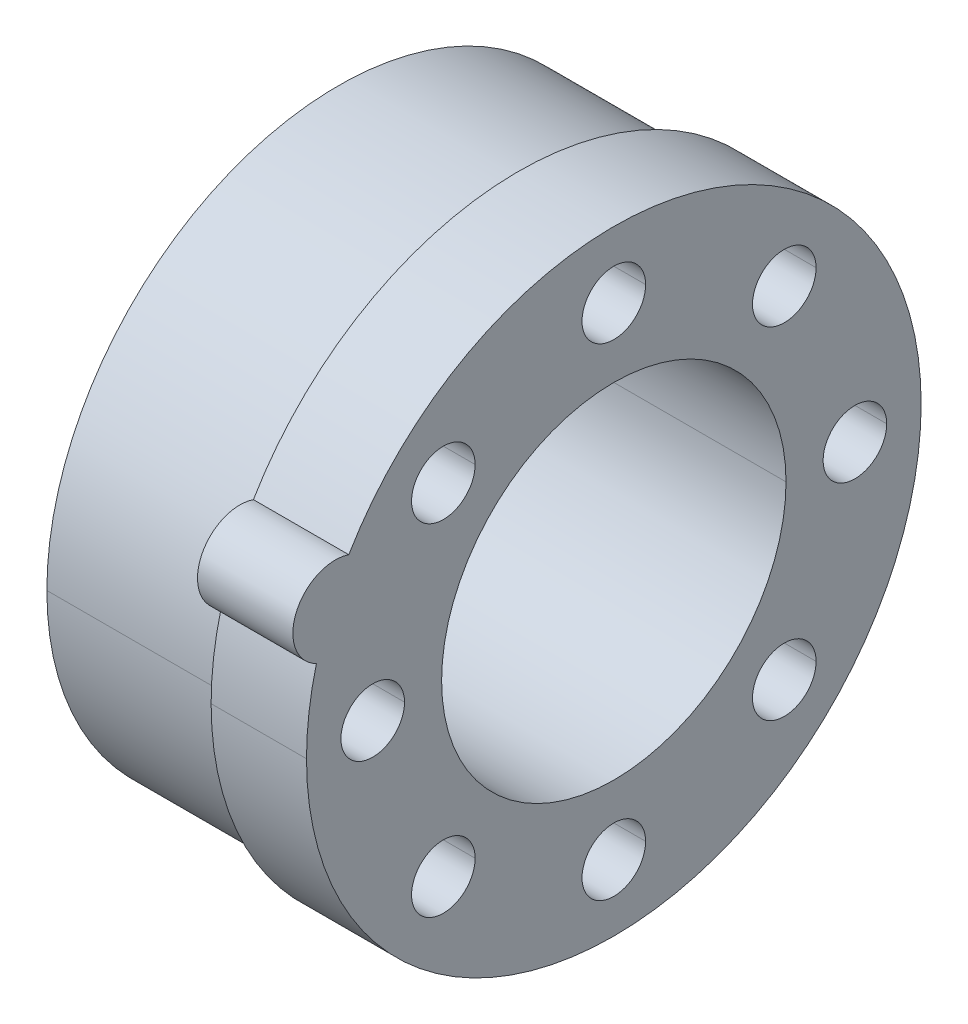
ISO-10303-21;
HEADER;
FILE_DESCRIPTION(('STEP AP214'),'2;1');
FILE_NAME('part.step','',(''),(''),'','','');
FILE_SCHEMA(('AUTOMOTIVE_DESIGN { 1 0 10303 214 1 1 1 1 }'));
ENDSEC;
DATA;
#1=APPLICATION_CONTEXT('core data for automotive mechanical design processes');
#2=APPLICATION_PROTOCOL_DEFINITION('international standard','automotive_design',2000,#1);
#3=PRODUCT_CONTEXT('',#1,'mechanical');
#4=PRODUCT('Part','Part','',(#3));
#5=PRODUCT_RELATED_PRODUCT_CATEGORY('part','',(#4));
#6=PRODUCT_DEFINITION_FORMATION('','',#4);
#7=PRODUCT_DEFINITION_CONTEXT('part definition',#1,'design');
#8=PRODUCT_DEFINITION('design','',#6,#7);
#9=PRODUCT_DEFINITION_SHAPE('','',#8);
#10=(LENGTH_UNIT() NAMED_UNIT(*) SI_UNIT(.MILLI.,.METRE.));
#11=(NAMED_UNIT(*) PLANE_ANGLE_UNIT() SI_UNIT($,.RADIAN.));
#12=(NAMED_UNIT(*) SI_UNIT($,.STERADIAN.) SOLID_ANGLE_UNIT());
#13=UNCERTAINTY_MEASURE_WITH_UNIT(LENGTH_MEASURE(1.E-05),#10,'distance_accuracy_value','');
#14=(GEOMETRIC_REPRESENTATION_CONTEXT(3) GLOBAL_UNCERTAINTY_ASSIGNED_CONTEXT((#13)) GLOBAL_UNIT_ASSIGNED_CONTEXT((#10,
#11,#12)) REPRESENTATION_CONTEXT('',''));
#15=CARTESIAN_POINT('',(0.,0.,0.));
#16=DIRECTION('',(0.,0.,1.));
#17=DIRECTION('',(1.,0.,0.));
#18=AXIS2_PLACEMENT_3D('',#15,#16,#17);
#19=CARTESIAN_POINT('',(-2.14839578115564,10.8873436507863,26.2843726999463));
#20=DIRECTION('',(1.,0.,0.));
#21=DIRECTION('',(0.,0.,-1.));
#22=AXIS2_PLACEMENT_3D('',#19,#20,#21);
#23=CYLINDRICAL_SURFACE('',#22,4.);
#24=DIRECTION('',(1.,0.,0.));
#25=VECTOR('',#24,1.);
#26=CARTESIAN_POINT('',(21.5,14.679075411372,25.0104926994102));
#27=LINE('',#26,#25);
#28=CARTESIAN_POINT('',(17.,14.679075411372,25.0104926994102));
#29=VERTEX_POINT('',#28);
#30=CARTESIAN_POINT('',(26.,14.679075411372,25.0104926994102));
#31=VERTEX_POINT('',#30);
#32=EDGE_CURVE('E242',#29,#31,#27,.T.);
#33=ORIENTED_EDGE('',*,*,#32,.F.);
#34=CARTESIAN_POINT('',(17.,10.8873436507863,26.2843726999463));
#35=DIRECTION('',(1.,0.,0.));
#36=DIRECTION('',(0.,0.,1.));
#37=AXIS2_PLACEMENT_3D('',#34,#35,#36);
#38=CIRCLE('',#37,4.);
#39=CARTESIAN_POINT('',(17.,7.30541522363872,28.0647627534997));
#40=VERTEX_POINT('',#39);
#41=EDGE_CURVE('E27',#29,#40,#38,.T.);
#42=ORIENTED_EDGE('',*,*,#41,.T.);
#43=DIRECTION('',(-1.,0.,0.));
#44=VECTOR('',#43,1.);
#45=CARTESIAN_POINT('',(21.5,7.30541522363872,28.0647627534997));
#46=LINE('',#45,#44);
#47=CARTESIAN_POINT('',(26.,7.30541522363872,28.0647627534997));
#48=VERTEX_POINT('',#47);
#49=EDGE_CURVE('E245',#48,#40,#46,.T.);
#50=ORIENTED_EDGE('',*,*,#49,.F.);
#51=CARTESIAN_POINT('',(26.,10.8873436507863,26.2843726999463));
#52=DIRECTION('',(1.,0.,0.));
#53=DIRECTION('',(0.,0.,-1.));
#54=AXIS2_PLACEMENT_3D('',#51,#52,#53);
#55=CIRCLE('',#54,4.);
#56=EDGE_CURVE('E240',#31,#48,#55,.T.);
#57=ORIENTED_EDGE('',*,*,#56,.F.);
#58=EDGE_LOOP('',(#33,#42,#50,#57));
#59=FACE_BOUND('',#58,.T.);
#60=ADVANCED_FACE('F16',(#59),#23,.T.);
#61=CARTESIAN_POINT('',(0.,22.75,0.));
#62=DIRECTION('',(1.,0.,0.));
#63=DIRECTION('',(0.,0.,-1.));
#64=AXIS2_PLACEMENT_3D('',#61,#62,#63);
#65=CYLINDRICAL_SURFACE('',#64,3.);
#66=DIRECTION('',(1.,0.,0.));
#67=VECTOR('',#66,1.);
#68=CARTESIAN_POINT('',(0.,22.75,3.));
#69=LINE('',#68,#67);
#70=CARTESIAN_POINT('',(0.,22.75,3.));
#71=VERTEX_POINT('',#70);
#72=CARTESIAN_POINT('',(26.,22.75,3.));
#73=VERTEX_POINT('',#72);
#74=EDGE_CURVE('E415',#71,#73,#69,.T.);
#75=ORIENTED_EDGE('',*,*,#74,.F.);
#76=CARTESIAN_POINT('',(0.,22.75,0.));
#77=DIRECTION('',(1.,0.,0.));
#78=DIRECTION('',(0.,0.,-1.));
#79=AXIS2_PLACEMENT_3D('',#76,#77,#78);
#80=CIRCLE('',#79,3.);
#81=CARTESIAN_POINT('',(0.,22.75,-3.));
#82=VERTEX_POINT('',#81);
#83=EDGE_CURVE('E317',#82,#71,#80,.T.);
#84=ORIENTED_EDGE('',*,*,#83,.F.);
#85=DIRECTION('',(1.,0.,0.));
#86=VECTOR('',#85,1.);
#87=CARTESIAN_POINT('',(0.,22.75,-3.));
#88=LINE('',#87,#86);
#89=CARTESIAN_POINT('',(26.,22.75,-3.));
#90=VERTEX_POINT('',#89);
#91=EDGE_CURVE('E414',#82,#90,#88,.T.);
#92=ORIENTED_EDGE('',*,*,#91,.T.);
#93=CARTESIAN_POINT('',(26.,22.75,0.));
#94=DIRECTION('',(1.,0.,0.));
#95=DIRECTION('',(0.,0.,-1.));
#96=AXIS2_PLACEMENT_3D('',#93,#94,#95);
#97=CIRCLE('',#96,3.);
#98=EDGE_CURVE('E197',#90,#73,#97,.T.);
#99=ORIENTED_EDGE('',*,*,#98,.T.);
#100=EDGE_LOOP('',(#75,#84,#92,#99));
#101=FACE_BOUND('',#100,.T.);
#102=ADVANCED_FACE('F967',(#101),#65,.F.);
#103=CARTESIAN_POINT('',(0.,16.0866792719953,-16.0866792719945));
#104=DIRECTION('',(1.,0.,0.));
#105=DIRECTION('',(0.,0.,-1.));
#106=AXIS2_PLACEMENT_3D('',#103,#104,#105);
#107=CYLINDRICAL_SURFACE('',#106,3.00000000000019);
#108=DIRECTION('',(1.,0.,0.));
#109=VECTOR('',#108,1.);
#110=CARTESIAN_POINT('',(0.,16.0866792719953,-13.0866792719943));
#111=LINE('',#110,#109);
#112=CARTESIAN_POINT('',(0.,16.0866792719953,-13.0866792719943));
#113=VERTEX_POINT('',#112);
#114=CARTESIAN_POINT('',(26.,16.0866792719953,-13.0866792719943));
#115=VERTEX_POINT('',#114);
#116=EDGE_CURVE('E309',#113,#115,#111,.T.);
#117=ORIENTED_EDGE('',*,*,#116,.F.);
#118=CARTESIAN_POINT('',(0.,16.0866792719953,-16.0866792719945));
#119=DIRECTION('',(1.,0.,0.));
#120=DIRECTION('',(0.,0.,-1.));
#121=AXIS2_PLACEMENT_3D('',#118,#119,#120);
#122=CIRCLE('',#121,3.00000000000019);
#123=CARTESIAN_POINT('',(0.,16.0866792719953,-19.0866792719947));
#124=VERTEX_POINT('',#123);
#125=EDGE_CURVE('E184',#124,#113,#122,.T.);
#126=ORIENTED_EDGE('',*,*,#125,.F.);
#127=DIRECTION('',(1.,0.,0.));
#128=VECTOR('',#127,1.);
#129=CARTESIAN_POINT('',(0.,16.0866792719953,-19.0866792719947));
#130=LINE('',#129,#128);
#131=CARTESIAN_POINT('',(26.,16.0866792719953,-19.0866792719947));
#132=VERTEX_POINT('',#131);
#133=EDGE_CURVE('E324',#124,#132,#130,.T.);
#134=ORIENTED_EDGE('',*,*,#133,.T.);
#135=CARTESIAN_POINT('',(26.,16.0866792719953,-16.0866792719945));
#136=DIRECTION('',(1.,0.,0.));
#137=DIRECTION('',(0.,0.,-1.));
#138=AXIS2_PLACEMENT_3D('',#135,#136,#137);
#139=CIRCLE('',#138,3.00000000000019);
#140=EDGE_CURVE('E280',#132,#115,#139,.T.);
#141=ORIENTED_EDGE('',*,*,#140,.T.);
#142=EDGE_LOOP('',(#117,#126,#134,#141));
#143=FACE_BOUND('',#142,.T.);
#144=ADVANCED_FACE('F949',(#143),#107,.F.);
#145=CARTESIAN_POINT('',(0.,1.93560256142298E-12,-22.750000000002));
#146=DIRECTION('',(1.,0.,0.));
#147=DIRECTION('',(0.,0.,-1.));
#148=AXIS2_PLACEMENT_3D('',#145,#146,#147);
#149=CYLINDRICAL_SURFACE('',#148,3.00000000000136);
#150=DIRECTION('',(1.,0.,0.));
#151=VECTOR('',#150,1.);
#152=CARTESIAN_POINT('',(0.,1.93596995546273E-12,-19.7500000000006));
#153=LINE('',#152,#151);
#154=CARTESIAN_POINT('',(0.,1.93596995546273E-12,-19.7500000000006));
#155=VERTEX_POINT('',#154);
#156=CARTESIAN_POINT('',(26.,1.93596995546273E-12,-19.7500000000006));
#157=VERTEX_POINT('',#156);
#158=EDGE_CURVE('E323',#155,#157,#153,.T.);
#159=ORIENTED_EDGE('',*,*,#158,.F.);
#160=CARTESIAN_POINT('',(0.,1.93560256142298E-12,-22.750000000002));
#161=DIRECTION('',(1.,0.,0.));
#162=DIRECTION('',(0.,0.,-1.));
#163=AXIS2_PLACEMENT_3D('',#160,#161,#162);
#164=CIRCLE('',#163,3.00000000000136);
#165=CARTESIAN_POINT('',(0.,1.93560256142298E-12,-25.7500000000033));
#166=VERTEX_POINT('',#165);
#167=EDGE_CURVE('E316',#166,#155,#164,.T.);
#168=ORIENTED_EDGE('',*,*,#167,.F.);
#169=DIRECTION('',(1.,0.,0.));
#170=VECTOR('',#169,1.);
#171=CARTESIAN_POINT('',(0.,1.93560256142298E-12,-25.7500000000033));
#172=LINE('',#171,#170);
#173=CARTESIAN_POINT('',(26.,1.93560256142298E-12,-25.7500000000033));
#174=VERTEX_POINT('',#173);
#175=EDGE_CURVE('E353',#166,#174,#172,.T.);
#176=ORIENTED_EDGE('',*,*,#175,.T.);
#177=CARTESIAN_POINT('',(26.,1.93560256142298E-12,-22.750000000002));
#178=DIRECTION('',(1.,0.,0.));
#179=DIRECTION('',(0.,0.,-1.));
#180=AXIS2_PLACEMENT_3D('',#177,#178,#179);
#181=CIRCLE('',#180,3.00000000000136);
#182=EDGE_CURVE('E283',#174,#157,#181,.T.);
#183=ORIENTED_EDGE('',*,*,#182,.T.);
#184=EDGE_LOOP('',(#159,#168,#176,#183));
#185=FACE_BOUND('',#184,.T.);
#186=ADVANCED_FACE('F945',(#185),#149,.F.);
#187=CARTESIAN_POINT('',(0.,-16.0866792719926,-16.0866792719973));
#188=DIRECTION('',(1.,0.,0.));
#189=DIRECTION('',(0.,0.,-1.));
#190=AXIS2_PLACEMENT_3D('',#187,#188,#189);
#191=CYLINDRICAL_SURFACE('',#190,3.00000000000287);
#192=DIRECTION('',(1.,0.,0.));
#193=VECTOR('',#192,1.);
#194=CARTESIAN_POINT('',(0.,-16.0866792719926,-13.0866792719944));
#195=LINE('',#194,#193);
#196=CARTESIAN_POINT('',(0.,-16.0866792719926,-13.0866792719944));
#197=VERTEX_POINT('',#196);
#198=CARTESIAN_POINT('',(26.,-16.0866792719926,-13.0866792719944));
#199=VERTEX_POINT('',#198);
#200=EDGE_CURVE('E293',#197,#199,#195,.T.);
#201=ORIENTED_EDGE('',*,*,#200,.F.);
#202=CARTESIAN_POINT('',(0.,-16.0866792719926,-16.0866792719973));
#203=DIRECTION('',(1.,0.,0.));
#204=DIRECTION('',(0.,0.,-1.));
#205=AXIS2_PLACEMENT_3D('',#202,#203,#204);
#206=CIRCLE('',#205,3.00000000000287);
#207=CARTESIAN_POINT('',(0.,-16.0866792719926,-19.0866792720002));
#208=VERTEX_POINT('',#207);
#209=EDGE_CURVE('E367',#208,#197,#206,.T.);
#210=ORIENTED_EDGE('',*,*,#209,.F.);
#211=DIRECTION('',(1.,0.,0.));
#212=VECTOR('',#211,1.);
#213=CARTESIAN_POINT('',(0.,-16.0866792719926,-19.0866792720002));
#214=LINE('',#213,#212);
#215=CARTESIAN_POINT('',(26.,-16.0866792719926,-19.0866792720002));
#216=VERTEX_POINT('',#215);
#217=EDGE_CURVE('E302',#208,#216,#214,.T.);
#218=ORIENTED_EDGE('',*,*,#217,.T.);
#219=CARTESIAN_POINT('',(26.,-16.0866792719926,-16.0866792719973));
#220=DIRECTION('',(1.,0.,0.));
#221=DIRECTION('',(0.,0.,-1.));
#222=AXIS2_PLACEMENT_3D('',#219,#220,#221);
#223=CIRCLE('',#222,3.00000000000287);
#224=EDGE_CURVE('E292',#216,#199,#223,.T.);
#225=ORIENTED_EDGE('',*,*,#224,.T.);
#226=EDGE_LOOP('',(#201,#210,#218,#225));
#227=FACE_BOUND('',#226,.T.);
#228=ADVANCED_FACE('F435',(#227),#191,.F.);
#229=CARTESIAN_POINT('',(0.,-22.75,-3.87120512284596E-12));
#230=DIRECTION('',(1.,0.,0.));
#231=DIRECTION('',(0.,0.,-1.));
#232=AXIS2_PLACEMENT_3D('',#229,#230,#231);
#233=CYLINDRICAL_SURFACE('',#232,3.00000000000386);
#234=DIRECTION('',(1.,0.,0.));
#235=VECTOR('',#234,1.);
#236=CARTESIAN_POINT('',(0.,-22.75,3.));
#237=LINE('',#236,#235);
#238=CARTESIAN_POINT('',(0.,-22.75,3.));
#239=VERTEX_POINT('',#238);
#240=CARTESIAN_POINT('',(26.,-22.75,3.));
#241=VERTEX_POINT('',#240);
#242=EDGE_CURVE('E308',#239,#241,#237,.T.);
#243=ORIENTED_EDGE('',*,*,#242,.F.);
#244=CARTESIAN_POINT('',(0.,-22.75,-3.87120512284596E-12));
#245=DIRECTION('',(1.,0.,0.));
#246=DIRECTION('',(0.,0.,-1.));
#247=AXIS2_PLACEMENT_3D('',#244,#245,#246);
#248=CIRCLE('',#247,3.00000000000386);
#249=CARTESIAN_POINT('',(0.,-22.75,-3.00000000000773));
#250=VERTEX_POINT('',#249);
#251=EDGE_CURVE('E370',#250,#239,#248,.T.);
#252=ORIENTED_EDGE('',*,*,#251,.F.);
#253=DIRECTION('',(1.,0.,0.));
#254=VECTOR('',#253,1.);
#255=CARTESIAN_POINT('',(0.,-22.75,-3.00000000000773));
#256=LINE('',#255,#254);
#257=CARTESIAN_POINT('',(26.,-22.75,-3.00000000000773));
#258=VERTEX_POINT('',#257);
#259=EDGE_CURVE('E307',#250,#258,#256,.T.);
#260=ORIENTED_EDGE('',*,*,#259,.T.);
#261=CARTESIAN_POINT('',(26.,-22.75,-3.87120512284596E-12));
#262=DIRECTION('',(1.,0.,0.));
#263=DIRECTION('',(0.,0.,-1.));
#264=AXIS2_PLACEMENT_3D('',#261,#262,#263);
#265=CIRCLE('',#264,3.00000000000386);
#266=EDGE_CURVE('E395',#258,#241,#265,.T.);
#267=ORIENTED_EDGE('',*,*,#266,.T.);
#268=EDGE_LOOP('',(#243,#252,#260,#267));
#269=FACE_BOUND('',#268,.T.);
#270=ADVANCED_FACE('F840',(#269),#233,.F.);
#271=CARTESIAN_POINT('',(0.,-16.0866792719953,16.0866792719907));
#272=DIRECTION('',(1.,0.,0.));
#273=DIRECTION('',(0.,0.,-1.));
#274=AXIS2_PLACEMENT_3D('',#271,#272,#273);
#275=CYLINDRICAL_SURFACE('',#274,3.00000000000375);
#276=DIRECTION('',(1.,0.,0.));
#277=VECTOR('',#276,1.);
#278=CARTESIAN_POINT('',(0.,-16.0866792719953,19.0866792719944));
#279=LINE('',#278,#277);
#280=CARTESIAN_POINT('',(0.,-16.0866792719953,19.0866792719944));
#281=VERTEX_POINT('',#280);
#282=CARTESIAN_POINT('',(26.,-16.0866792719953,19.0866792719944));
#283=VERTEX_POINT('',#282);
#284=EDGE_CURVE('E354',#281,#283,#279,.T.);
#285=ORIENTED_EDGE('',*,*,#284,.F.);
#286=CARTESIAN_POINT('',(0.,-16.0866792719953,16.0866792719907));
#287=DIRECTION('',(1.,0.,0.));
#288=DIRECTION('',(0.,0.,-1.));
#289=AXIS2_PLACEMENT_3D('',#286,#287,#288);
#290=CIRCLE('',#289,3.00000000000375);
#291=CARTESIAN_POINT('',(0.,-16.0866792719953,13.0866792719869));
#292=VERTEX_POINT('',#291);
#293=EDGE_CURVE('E499',#292,#281,#290,.T.);
#294=ORIENTED_EDGE('',*,*,#293,.F.);
#295=DIRECTION('',(1.,0.,0.));
#296=VECTOR('',#295,1.);
#297=CARTESIAN_POINT('',(0.,-16.0866792719953,13.0866792719869));
#298=LINE('',#297,#296);
#299=CARTESIAN_POINT('',(26.,-16.0866792719953,13.0866792719869));
#300=VERTEX_POINT('',#299);
#301=EDGE_CURVE('E425',#292,#300,#298,.T.);
#302=ORIENTED_EDGE('',*,*,#301,.T.);
#303=CARTESIAN_POINT('',(26.,-16.0866792719953,16.0866792719907));
#304=DIRECTION('',(1.,0.,0.));
#305=DIRECTION('',(0.,0.,-1.));
#306=AXIS2_PLACEMENT_3D('',#303,#304,#305);
#307=CIRCLE('',#306,3.00000000000375);
#308=EDGE_CURVE('E389',#300,#283,#307,.T.);
#309=ORIENTED_EDGE('',*,*,#308,.T.);
#310=EDGE_LOOP('',(#285,#294,#302,#309));
#311=FACE_BOUND('',#310,.T.);
#312=ADVANCED_FACE('F832',(#311),#275,.F.);
#313=CARTESIAN_POINT('',(0.,-1.93838863289104E-12,22.7499999999981));
#314=DIRECTION('',(1.,0.,0.));
#315=DIRECTION('',(0.,0.,-1.));
#316=AXIS2_PLACEMENT_3D('',#313,#314,#315);
#317=CYLINDRICAL_SURFACE('',#316,3.00000000000264);
#318=DIRECTION('',(1.,0.,0.));
#319=VECTOR('',#318,1.);
#320=CARTESIAN_POINT('',(0.,-1.9380212388513E-12,25.7500000000007));
#321=LINE('',#320,#319);
#322=CARTESIAN_POINT('',(0.,-1.9380212388513E-12,25.7500000000007));
#323=VERTEX_POINT('',#322);
#324=CARTESIAN_POINT('',(26.,-1.9380212388513E-12,25.7500000000007));
#325=VERTEX_POINT('',#324);
#326=EDGE_CURVE('E376',#323,#325,#321,.T.);
#327=ORIENTED_EDGE('',*,*,#326,.F.);
#328=CARTESIAN_POINT('',(0.,-1.93838863289104E-12,22.7499999999981));
#329=DIRECTION('',(1.,0.,0.));
#330=DIRECTION('',(0.,0.,-1.));
#331=AXIS2_PLACEMENT_3D('',#328,#329,#330);
#332=CIRCLE('',#331,3.00000000000264);
#333=CARTESIAN_POINT('',(0.,-1.93838863289104E-12,19.7499999999954));
#334=VERTEX_POINT('',#333);
#335=EDGE_CURVE('E510',#334,#323,#332,.T.);
#336=ORIENTED_EDGE('',*,*,#335,.F.);
#337=DIRECTION('',(1.,0.,0.));
#338=VECTOR('',#337,1.);
#339=CARTESIAN_POINT('',(0.,-1.93838863289104E-12,19.7499999999954));
#340=LINE('',#339,#338);
#341=CARTESIAN_POINT('',(26.,-1.93838863289104E-12,19.7499999999954));
#342=VERTEX_POINT('',#341);
#343=EDGE_CURVE('E375',#334,#342,#340,.T.);
#344=ORIENTED_EDGE('',*,*,#343,.T.);
#345=CARTESIAN_POINT('',(26.,-1.93838863289104E-12,22.7499999999981));
#346=DIRECTION('',(1.,0.,0.));
#347=DIRECTION('',(0.,0.,-1.));
#348=AXIS2_PLACEMENT_3D('',#345,#346,#347);
#349=CIRCLE('',#348,3.00000000000264);
#350=EDGE_CURVE('E385',#342,#325,#349,.T.);
#351=ORIENTED_EDGE('',*,*,#350,.T.);
#352=EDGE_LOOP('',(#327,#336,#344,#351));
#353=FACE_BOUND('',#352,.T.);
#354=ADVANCED_FACE('F828',(#353),#317,.F.);
#355=CARTESIAN_POINT('',(0.,16.0866792719926,16.0866792719934));
#356=DIRECTION('',(1.,0.,0.));
#357=DIRECTION('',(0.,0.,-1.));
#358=AXIS2_PLACEMENT_3D('',#355,#356,#357);
#359=CYLINDRICAL_SURFACE('',#358,3.00000000000122);
#360=DIRECTION('',(1.,0.,0.));
#361=VECTOR('',#360,1.);
#362=CARTESIAN_POINT('',(0.,16.0866792719926,19.0866792719946));
#363=LINE('',#362,#361);
#364=CARTESIAN_POINT('',(0.,16.0866792719926,19.0866792719946));
#365=VERTEX_POINT('',#364);
#366=CARTESIAN_POINT('',(26.,16.0866792719926,19.0866792719946));
#367=VERTEX_POINT('',#366);
#368=EDGE_CURVE('E284',#365,#367,#363,.T.);
#369=ORIENTED_EDGE('',*,*,#368,.F.);
#370=CARTESIAN_POINT('',(0.,16.0866792719926,16.0866792719934));
#371=DIRECTION('',(1.,0.,0.));
#372=DIRECTION('',(0.,0.,-1.));
#373=AXIS2_PLACEMENT_3D('',#370,#371,#372);
#374=CIRCLE('',#373,3.00000000000122);
#375=CARTESIAN_POINT('',(0.,16.0866792719926,13.0866792719922));
#376=VERTEX_POINT('',#375);
#377=EDGE_CURVE('E407',#376,#365,#374,.T.);
#378=ORIENTED_EDGE('',*,*,#377,.F.);
#379=DIRECTION('',(1.,0.,0.));
#380=VECTOR('',#379,1.);
#381=CARTESIAN_POINT('',(0.,16.0866792719926,13.0866792719922));
#382=LINE('',#381,#380);
#383=CARTESIAN_POINT('',(26.,16.0866792719926,13.0866792719922));
#384=VERTEX_POINT('',#383);
#385=EDGE_CURVE('E20',#376,#384,#382,.T.);
#386=ORIENTED_EDGE('',*,*,#385,.T.);
#387=CARTESIAN_POINT('',(26.,16.0866792719926,16.0866792719934));
#388=DIRECTION('',(1.,0.,0.));
#389=DIRECTION('',(0.,0.,-1.));
#390=AXIS2_PLACEMENT_3D('',#387,#388,#389);
#391=CIRCLE('',#390,3.00000000000122);
#392=EDGE_CURVE('E388',#384,#367,#391,.T.);
#393=ORIENTED_EDGE('',*,*,#392,.T.);
#394=EDGE_LOOP('',(#369,#378,#386,#393));
#395=FACE_BOUND('',#394,.T.);
#396=ADVANCED_FACE('F821',(#395),#359,.F.);
#397=CARTESIAN_POINT('',(17.,0.,0.));
#398=DIRECTION('',(-1.,0.,0.));
#399=DIRECTION('',(0.,0.,1.));
#400=AXIS2_PLACEMENT_3D('',#397,#398,#399);
#401=CYLINDRICAL_SURFACE('',#400,27.5);
#402=DIRECTION('',(-1.,0.,0.));
#403=VECTOR('',#402,1.);
#404=CARTESIAN_POINT('',(17.,0.,-27.5));
#405=LINE('',#404,#403);
#406=CARTESIAN_POINT('',(17.,0.,-27.5));
#407=VERTEX_POINT('',#406);
#408=CARTESIAN_POINT('',(0.,0.,-27.5));
#409=VERTEX_POINT('',#408);
#410=EDGE_CURVE('E381',#407,#409,#405,.T.);
#411=ORIENTED_EDGE('',*,*,#410,.F.);
#412=CARTESIAN_POINT('',(17.,0.,0.));
#413=DIRECTION('',(-1.,0.,0.));
#414=DIRECTION('',(0.,0.,1.));
#415=AXIS2_PLACEMENT_3D('',#412,#413,#414);
#416=CIRCLE('',#415,27.5);
#417=CARTESIAN_POINT('',(17.,0.,27.5));
#418=VERTEX_POINT('',#417);
#419=EDGE_CURVE('E10',#407,#418,#416,.T.);
#420=ORIENTED_EDGE('',*,*,#419,.T.);
#421=DIRECTION('',(-1.,0.,0.));
#422=VECTOR('',#421,1.);
#423=CARTESIAN_POINT('',(17.,0.,27.5));
#424=LINE('',#423,#422);
#425=CARTESIAN_POINT('',(0.,0.,27.5));
#426=VERTEX_POINT('',#425);
#427=EDGE_CURVE('E459',#418,#426,#424,.T.);
#428=ORIENTED_EDGE('',*,*,#427,.T.);
#429=CARTESIAN_POINT('',(0.,0.,0.));
#430=DIRECTION('',(-1.,0.,0.));
#431=DIRECTION('',(0.,0.,1.));
#432=AXIS2_PLACEMENT_3D('',#429,#430,#431);
#433=CIRCLE('',#432,27.5);
#434=EDGE_CURVE('E325',#409,#426,#433,.T.);
#435=ORIENTED_EDGE('',*,*,#434,.F.);
#436=EDGE_LOOP('',(#411,#420,#428,#435));
#437=FACE_BOUND('',#436,.T.);
#438=ADVANCED_FACE('F817',(#437),#401,.T.);
#439=CARTESIAN_POINT('',(17.,0.,0.));
#440=DIRECTION('',(-1.,0.,0.));
#441=DIRECTION('',(0.,0.,1.));
#442=AXIS2_PLACEMENT_3D('',#439,#440,#441);
#443=PLANE('',#442);
#444=CARTESIAN_POINT('',(17.,0.,0.));
#445=DIRECTION('',(-1.,0.,0.));
#446=DIRECTION('',(0.,0.,1.));
#447=AXIS2_PLACEMENT_3D('',#444,#445,#446);
#448=CIRCLE('',#447,27.5);
#449=EDGE_CURVE('E377',#418,#407,#448,.T.);
#450=ORIENTED_EDGE('',*,*,#449,.F.);
#451=ORIENTED_EDGE('',*,*,#419,.F.);
#452=EDGE_LOOP('',(#450,#451));
#453=FACE_BOUND('',#452,.T.);
#454=CARTESIAN_POINT('',(17.,0.,0.));
#455=DIRECTION('',(-1.,0.,0.));
#456=DIRECTION('',(0.,0.,1.));
#457=AXIS2_PLACEMENT_3D('',#454,#455,#456);
#458=CIRCLE('',#457,29.);
#459=CARTESIAN_POINT('',(17.,0.,-29.));
#460=VERTEX_POINT('',#459);
#461=EDGE_CURVE('E257',#29,#460,#458,.T.);
#462=ORIENTED_EDGE('',*,*,#461,.T.);
#463=CARTESIAN_POINT('',(17.,0.,0.));
#464=DIRECTION('',(-1.,0.,0.));
#465=DIRECTION('',(0.,0.,1.));
#466=AXIS2_PLACEMENT_3D('',#463,#464,#465);
#467=CIRCLE('',#466,29.);
#468=CARTESIAN_POINT('',(17.,0.,29.));
#469=VERTEX_POINT('',#468);
#470=EDGE_CURVE('E327',#460,#469,#467,.T.);
#471=ORIENTED_EDGE('',*,*,#470,.T.);
#472=CARTESIAN_POINT('',(17.,0.,0.));
#473=DIRECTION('',(-1.,0.,0.));
#474=DIRECTION('',(0.,0.,1.));
#475=AXIS2_PLACEMENT_3D('',#472,#473,#474);
#476=CIRCLE('',#475,29.);
#477=EDGE_CURVE('E249',#469,#40,#476,.T.);
#478=ORIENTED_EDGE('',*,*,#477,.T.);
#479=ORIENTED_EDGE('',*,*,#41,.F.);
#480=EDGE_LOOP('',(#462,#471,#478,#479));
#481=FACE_BOUND('',#480,.T.);
#482=ADVANCED_FACE('F547',(#453,#481),#443,.T.);
#483=CARTESIAN_POINT('',(26.,0.,0.));
#484=DIRECTION('',(-1.,0.,0.));
#485=DIRECTION('',(0.,0.,1.));
#486=AXIS2_PLACEMENT_3D('',#483,#484,#485);
#487=CYLINDRICAL_SURFACE('',#486,16.25);
#488=DIRECTION('',(-1.,0.,0.));
#489=VECTOR('',#488,1.);
#490=CARTESIAN_POINT('',(26.,0.,-16.25));
#491=LINE('',#490,#489);
#492=CARTESIAN_POINT('',(26.,0.,-16.25));
#493=VERTEX_POINT('',#492);
#494=CARTESIAN_POINT('',(0.,0.,-16.25));
#495=VERTEX_POINT('',#494);
#496=EDGE_CURVE('E531',#493,#495,#491,.T.);
#497=ORIENTED_EDGE('',*,*,#496,.F.);
#498=CARTESIAN_POINT('',(26.,0.,0.));
#499=DIRECTION('',(1.,0.,0.));
#500=DIRECTION('',(0.,0.,-1.));
#501=AXIS2_PLACEMENT_3D('',#498,#499,#500);
#502=CIRCLE('',#501,16.25);
#503=CARTESIAN_POINT('',(26.,0.,16.25));
#504=VERTEX_POINT('',#503);
#505=EDGE_CURVE('E248',#493,#504,#502,.T.);
#506=ORIENTED_EDGE('',*,*,#505,.T.);
#507=DIRECTION('',(-1.,0.,0.));
#508=VECTOR('',#507,1.);
#509=CARTESIAN_POINT('',(26.,0.,16.25));
#510=LINE('',#509,#508);
#511=CARTESIAN_POINT('',(0.,0.,16.25));
#512=VERTEX_POINT('',#511);
#513=EDGE_CURVE('E262',#504,#512,#510,.T.);
#514=ORIENTED_EDGE('',*,*,#513,.T.);
#515=CARTESIAN_POINT('',(0.,0.,0.));
#516=DIRECTION('',(1.,0.,0.));
#517=DIRECTION('',(0.,0.,-1.));
#518=AXIS2_PLACEMENT_3D('',#515,#516,#517);
#519=CIRCLE('',#518,16.25);
#520=EDGE_CURVE('E404',#495,#512,#519,.T.);
#521=ORIENTED_EDGE('',*,*,#520,.F.);
#522=EDGE_LOOP('',(#497,#506,#514,#521));
#523=FACE_BOUND('',#522,.T.);
#524=ADVANCED_FACE('F806',(#523),#487,.F.);
#525=CARTESIAN_POINT('',(26.,0.,0.));
#526=DIRECTION('',(1.,0.,0.));
#527=DIRECTION('',(0.,1.,0.));
#528=AXIS2_PLACEMENT_3D('',#525,#526,#527);
#529=PLANE('',#528);
#530=ORIENTED_EDGE('',*,*,#392,.F.);
#531=CARTESIAN_POINT('',(26.,16.0866792719926,16.0866792719934));
#532=DIRECTION('',(1.,0.,0.));
#533=DIRECTION('',(0.,0.,-1.));
#534=AXIS2_PLACEMENT_3D('',#531,#532,#533);
#535=CIRCLE('',#534,3.00000000000122);
#536=EDGE_CURVE('E288',#367,#384,#535,.T.);
#537=ORIENTED_EDGE('',*,*,#536,.F.);
#538=EDGE_LOOP('',(#530,#537));
#539=FACE_BOUND('',#538,.T.);
#540=ORIENTED_EDGE('',*,*,#350,.F.);
#541=CARTESIAN_POINT('',(26.,-1.93838863289104E-12,22.7499999999981));
#542=DIRECTION('',(1.,0.,0.));
#543=DIRECTION('',(0.,0.,-1.));
#544=AXIS2_PLACEMENT_3D('',#541,#542,#543);
#545=CIRCLE('',#544,3.00000000000264);
#546=EDGE_CURVE('E371',#325,#342,#545,.T.);
#547=ORIENTED_EDGE('',*,*,#546,.F.);
#548=EDGE_LOOP('',(#540,#547));
#549=FACE_BOUND('',#548,.T.);
#550=ORIENTED_EDGE('',*,*,#308,.F.);
#551=CARTESIAN_POINT('',(26.,-16.0866792719953,16.0866792719907));
#552=DIRECTION('',(1.,0.,0.));
#553=DIRECTION('',(0.,0.,-1.));
#554=AXIS2_PLACEMENT_3D('',#551,#552,#553);
#555=CIRCLE('',#554,3.00000000000375);
#556=EDGE_CURVE('E358',#283,#300,#555,.T.);
#557=ORIENTED_EDGE('',*,*,#556,.F.);
#558=EDGE_LOOP('',(#550,#557));
#559=FACE_BOUND('',#558,.T.);
#560=ORIENTED_EDGE('',*,*,#266,.F.);
#561=CARTESIAN_POINT('',(26.,-22.75,-3.87120512284596E-12));
#562=DIRECTION('',(1.,0.,0.));
#563=DIRECTION('',(0.,0.,-1.));
#564=AXIS2_PLACEMENT_3D('',#561,#562,#563);
#565=CIRCLE('',#564,3.00000000000386);
#566=EDGE_CURVE('E303',#241,#258,#565,.T.);
#567=ORIENTED_EDGE('',*,*,#566,.F.);
#568=EDGE_LOOP('',(#560,#567));
#569=FACE_BOUND('',#568,.T.);
#570=ORIENTED_EDGE('',*,*,#224,.F.);
#571=CARTESIAN_POINT('',(26.,-16.0866792719926,-16.0866792719973));
#572=DIRECTION('',(1.,0.,0.));
#573=DIRECTION('',(0.,0.,-1.));
#574=AXIS2_PLACEMENT_3D('',#571,#572,#573);
#575=CIRCLE('',#574,3.00000000000287);
#576=EDGE_CURVE('E297',#199,#216,#575,.T.);
#577=ORIENTED_EDGE('',*,*,#576,.F.);
#578=EDGE_LOOP('',(#570,#577));
#579=FACE_BOUND('',#578,.T.);
#580=ORIENTED_EDGE('',*,*,#182,.F.);
#581=CARTESIAN_POINT('',(26.,1.93560256142298E-12,-22.750000000002));
#582=DIRECTION('',(1.,0.,0.));
#583=DIRECTION('',(0.,0.,-1.));
#584=AXIS2_PLACEMENT_3D('',#581,#582,#583);
#585=CIRCLE('',#584,3.00000000000136);
#586=EDGE_CURVE('E349',#157,#174,#585,.T.);
#587=ORIENTED_EDGE('',*,*,#586,.F.);
#588=EDGE_LOOP('',(#580,#587));
#589=FACE_BOUND('',#588,.T.);
#590=ORIENTED_EDGE('',*,*,#140,.F.);
#591=CARTESIAN_POINT('',(26.,16.0866792719953,-16.0866792719945));
#592=DIRECTION('',(1.,0.,0.));
#593=DIRECTION('',(0.,0.,-1.));
#594=AXIS2_PLACEMENT_3D('',#591,#592,#593);
#595=CIRCLE('',#594,3.00000000000019);
#596=EDGE_CURVE('E313',#115,#132,#595,.T.);
#597=ORIENTED_EDGE('',*,*,#596,.F.);
#598=EDGE_LOOP('',(#590,#597));
#599=FACE_BOUND('',#598,.T.);
#600=ORIENTED_EDGE('',*,*,#98,.F.);
#601=CARTESIAN_POINT('',(26.,22.75,0.));
#602=DIRECTION('',(1.,0.,0.));
#603=DIRECTION('',(0.,0.,-1.));
#604=AXIS2_PLACEMENT_3D('',#601,#602,#603);
#605=CIRCLE('',#604,3.);
#606=EDGE_CURVE('E411',#73,#90,#605,.T.);
#607=ORIENTED_EDGE('',*,*,#606,.F.);
#608=EDGE_LOOP('',(#600,#607));
#609=FACE_BOUND('',#608,.T.);
#610=CARTESIAN_POINT('',(26.,0.,0.));
#611=DIRECTION('',(1.,0.,0.));
#612=DIRECTION('',(0.,0.,-1.));
#613=AXIS2_PLACEMENT_3D('',#610,#611,#612);
#614=CIRCLE('',#613,16.25);
#615=EDGE_CURVE('E480',#504,#493,#614,.T.);
#616=ORIENTED_EDGE('',*,*,#615,.F.);
#617=ORIENTED_EDGE('',*,*,#505,.F.);
#618=EDGE_LOOP('',(#616,#617));
#619=FACE_BOUND('',#618,.T.);
#620=CARTESIAN_POINT('',(26.,0.,0.));
#621=DIRECTION('',(1.,0.,0.));
#622=DIRECTION('',(0.,0.,-1.));
#623=AXIS2_PLACEMENT_3D('',#620,#621,#622);
#624=CIRCLE('',#623,29.);
#625=CARTESIAN_POINT('',(26.,0.,29.));
#626=VERTEX_POINT('',#625);
#627=EDGE_CURVE('E347',#48,#626,#624,.T.);
#628=ORIENTED_EDGE('',*,*,#627,.T.);
#629=CARTESIAN_POINT('',(26.,0.,0.));
#630=DIRECTION('',(1.,0.,0.));
#631=DIRECTION('',(0.,0.,-1.));
#632=AXIS2_PLACEMENT_3D('',#629,#630,#631);
#633=CIRCLE('',#632,29.);
#634=CARTESIAN_POINT('',(26.,0.,-29.));
#635=VERTEX_POINT('',#634);
#636=EDGE_CURVE('E235',#626,#635,#633,.T.);
#637=ORIENTED_EDGE('',*,*,#636,.T.);
#638=CARTESIAN_POINT('',(26.,0.,0.));
#639=DIRECTION('',(1.,0.,0.));
#640=DIRECTION('',(0.,0.,-1.));
#641=AXIS2_PLACEMENT_3D('',#638,#639,#640);
#642=CIRCLE('',#641,29.);
#643=EDGE_CURVE('E255',#635,#31,#642,.T.);
#644=ORIENTED_EDGE('',*,*,#643,.T.);
#645=ORIENTED_EDGE('',*,*,#56,.T.);
#646=EDGE_LOOP('',(#628,#637,#644,#645));
#647=FACE_BOUND('',#646,.T.);
#648=ADVANCED_FACE('F18',(#539,#549,#559,#569,#579,#589,#599,#609,#619,#647),#529,.T.);
#649=CARTESIAN_POINT('',(26.,0.,0.));
#650=DIRECTION('',(-1.,0.,0.));
#651=DIRECTION('',(0.,0.,1.));
#652=AXIS2_PLACEMENT_3D('',#649,#650,#651);
#653=CYLINDRICAL_SURFACE('',#652,29.);
#654=DIRECTION('',(-1.,0.,0.));
#655=VECTOR('',#654,1.);
#656=CARTESIAN_POINT('',(26.,0.,29.));
#657=LINE('',#656,#655);
#658=EDGE_CURVE('E279',#626,#469,#657,.T.);
#659=ORIENTED_EDGE('',*,*,#658,.F.);
#660=ORIENTED_EDGE('',*,*,#627,.F.);
#661=ORIENTED_EDGE('',*,*,#49,.T.);
#662=ORIENTED_EDGE('',*,*,#477,.F.);
#663=EDGE_LOOP('',(#659,#660,#661,#662));
#664=FACE_BOUND('',#663,.T.);
#665=ADVANCED_FACE('F447',(#664),#653,.T.);
#666=CARTESIAN_POINT('',(0.,0.,0.));
#667=DIRECTION('',(1.,0.,0.));
#668=DIRECTION('',(0.,1.,0.));
#669=AXIS2_PLACEMENT_3D('',#666,#667,#668);
#670=PLANE('',#669);
#671=CARTESIAN_POINT('',(0.,0.,0.));
#672=DIRECTION('',(1.,0.,0.));
#673=DIRECTION('',(0.,0.,-1.));
#674=AXIS2_PLACEMENT_3D('',#671,#672,#673);
#675=CIRCLE('',#674,16.25);
#676=EDGE_CURVE('E271',#512,#495,#675,.T.);
#677=ORIENTED_EDGE('',*,*,#676,.T.);
#678=ORIENTED_EDGE('',*,*,#520,.T.);
#679=EDGE_LOOP('',(#677,#678));
#680=FACE_BOUND('',#679,.T.);
#681=ORIENTED_EDGE('',*,*,#377,.T.);
#682=CARTESIAN_POINT('',(0.,16.0866792719926,16.0866792719934));
#683=DIRECTION('',(1.,0.,0.));
#684=DIRECTION('',(0.,0.,-1.));
#685=AXIS2_PLACEMENT_3D('',#682,#683,#684);
#686=CIRCLE('',#685,3.00000000000122);
#687=EDGE_CURVE('E289',#365,#376,#686,.T.);
#688=ORIENTED_EDGE('',*,*,#687,.T.);
#689=EDGE_LOOP('',(#681,#688));
#690=FACE_BOUND('',#689,.T.);
#691=ORIENTED_EDGE('',*,*,#335,.T.);
#692=CARTESIAN_POINT('',(0.,-1.93838863289104E-12,22.7499999999981));
#693=DIRECTION('',(1.,0.,0.));
#694=DIRECTION('',(0.,0.,-1.));
#695=AXIS2_PLACEMENT_3D('',#692,#693,#694);
#696=CIRCLE('',#695,3.00000000000264);
#697=EDGE_CURVE('E421',#323,#334,#696,.T.);
#698=ORIENTED_EDGE('',*,*,#697,.T.);
#699=EDGE_LOOP('',(#691,#698));
#700=FACE_BOUND('',#699,.T.);
#701=ORIENTED_EDGE('',*,*,#293,.T.);
#702=CARTESIAN_POINT('',(0.,-16.0866792719953,16.0866792719907));
#703=DIRECTION('',(1.,0.,0.));
#704=DIRECTION('',(0.,0.,-1.));
#705=AXIS2_PLACEMENT_3D('',#702,#703,#704);
#706=CIRCLE('',#705,3.00000000000375);
#707=EDGE_CURVE('E359',#281,#292,#706,.T.);
#708=ORIENTED_EDGE('',*,*,#707,.T.);
#709=EDGE_LOOP('',(#701,#708));
#710=FACE_BOUND('',#709,.T.);
#711=ORIENTED_EDGE('',*,*,#251,.T.);
#712=CARTESIAN_POINT('',(0.,-22.75,-3.87120512284596E-12));
#713=DIRECTION('',(1.,0.,0.));
#714=DIRECTION('',(0.,0.,-1.));
#715=AXIS2_PLACEMENT_3D('',#712,#713,#714);
#716=CIRCLE('',#715,3.00000000000386);
#717=EDGE_CURVE('E366',#239,#250,#716,.T.);
#718=ORIENTED_EDGE('',*,*,#717,.T.);
#719=EDGE_LOOP('',(#711,#718));
#720=FACE_BOUND('',#719,.T.);
#721=ORIENTED_EDGE('',*,*,#209,.T.);
#722=CARTESIAN_POINT('',(0.,-16.0866792719926,-16.0866792719973));
#723=DIRECTION('',(1.,0.,0.));
#724=DIRECTION('',(0.,0.,-1.));
#725=AXIS2_PLACEMENT_3D('',#722,#723,#724);
#726=CIRCLE('',#725,3.00000000000287);
#727=EDGE_CURVE('E298',#197,#208,#726,.T.);
#728=ORIENTED_EDGE('',*,*,#727,.T.);
#729=EDGE_LOOP('',(#721,#728));
#730=FACE_BOUND('',#729,.T.);
#731=ORIENTED_EDGE('',*,*,#167,.T.);
#732=CARTESIAN_POINT('',(0.,1.93560256142298E-12,-22.750000000002));
#733=DIRECTION('',(1.,0.,0.));
#734=DIRECTION('',(0.,0.,-1.));
#735=AXIS2_PLACEMENT_3D('',#732,#733,#734);
#736=CIRCLE('',#735,3.00000000000136);
#737=EDGE_CURVE('E320',#155,#166,#736,.T.);
#738=ORIENTED_EDGE('',*,*,#737,.T.);
#739=EDGE_LOOP('',(#731,#738));
#740=FACE_BOUND('',#739,.T.);
#741=ORIENTED_EDGE('',*,*,#125,.T.);
#742=CARTESIAN_POINT('',(0.,16.0866792719953,-16.0866792719945));
#743=DIRECTION('',(1.,0.,0.));
#744=DIRECTION('',(0.,0.,-1.));
#745=AXIS2_PLACEMENT_3D('',#742,#743,#744);
#746=CIRCLE('',#745,3.00000000000019);
#747=EDGE_CURVE('E275',#113,#124,#746,.T.);
#748=ORIENTED_EDGE('',*,*,#747,.T.);
#749=EDGE_LOOP('',(#741,#748));
#750=FACE_BOUND('',#749,.T.);
#751=ORIENTED_EDGE('',*,*,#83,.T.);
#752=CARTESIAN_POINT('',(0.,22.75,0.));
#753=DIRECTION('',(1.,0.,0.));
#754=DIRECTION('',(0.,0.,-1.));
#755=AXIS2_PLACEMENT_3D('',#752,#753,#754);
#756=CIRCLE('',#755,3.);
#757=EDGE_CURVE('E483',#71,#82,#756,.T.);
#758=ORIENTED_EDGE('',*,*,#757,.T.);
#759=EDGE_LOOP('',(#751,#758));
#760=FACE_BOUND('',#759,.T.);
#761=CARTESIAN_POINT('',(0.,0.,0.));
#762=DIRECTION('',(-1.,0.,0.));
#763=DIRECTION('',(0.,0.,1.));
#764=AXIS2_PLACEMENT_3D('',#761,#762,#763);
#765=CIRCLE('',#764,27.5);
#766=EDGE_CURVE('E454',#426,#409,#765,.T.);
#767=ORIENTED_EDGE('',*,*,#766,.T.);
#768=ORIENTED_EDGE('',*,*,#434,.T.);
#769=EDGE_LOOP('',(#767,#768));
#770=FACE_BOUND('',#769,.T.);
#771=ADVANCED_FACE('F443',(#680,#690,#700,#710,#720,#730,#740,#750,#760,#770),#670,.F.);
#772=CARTESIAN_POINT('',(26.,0.,0.));
#773=DIRECTION('',(-1.,0.,0.));
#774=DIRECTION('',(0.,0.,1.));
#775=AXIS2_PLACEMENT_3D('',#772,#773,#774);
#776=CYLINDRICAL_SURFACE('',#775,29.);
#777=DIRECTION('',(-1.,0.,0.));
#778=VECTOR('',#777,1.);
#779=CARTESIAN_POINT('',(26.,0.,-29.));
#780=LINE('',#779,#778);
#781=EDGE_CURVE('E261',#635,#460,#780,.T.);
#782=ORIENTED_EDGE('',*,*,#781,.F.);
#783=ORIENTED_EDGE('',*,*,#636,.F.);
#784=ORIENTED_EDGE('',*,*,#658,.T.);
#785=ORIENTED_EDGE('',*,*,#470,.F.);
#786=EDGE_LOOP('',(#782,#783,#784,#785));
#787=FACE_BOUND('',#786,.T.);
#788=ADVANCED_FACE('F446',(#787),#776,.T.);
#789=CARTESIAN_POINT('',(26.,0.,0.));
#790=DIRECTION('',(-1.,0.,0.));
#791=DIRECTION('',(0.,0.,1.));
#792=AXIS2_PLACEMENT_3D('',#789,#790,#791);
#793=CYLINDRICAL_SURFACE('',#792,29.);
#794=ORIENTED_EDGE('',*,*,#643,.F.);
#795=ORIENTED_EDGE('',*,*,#781,.T.);
#796=ORIENTED_EDGE('',*,*,#461,.F.);
#797=ORIENTED_EDGE('',*,*,#32,.T.);
#798=EDGE_LOOP('',(#794,#795,#796,#797));
#799=FACE_BOUND('',#798,.T.);
#800=ADVANCED_FACE('F253',(#799),#793,.T.);
#801=CARTESIAN_POINT('',(26.,0.,0.));
#802=DIRECTION('',(-1.,0.,0.));
#803=DIRECTION('',(0.,0.,1.));
#804=AXIS2_PLACEMENT_3D('',#801,#802,#803);
#805=CYLINDRICAL_SURFACE('',#804,16.25);
#806=ORIENTED_EDGE('',*,*,#615,.T.);
#807=ORIENTED_EDGE('',*,*,#496,.T.);
#808=ORIENTED_EDGE('',*,*,#676,.F.);
#809=ORIENTED_EDGE('',*,*,#513,.F.);
#810=EDGE_LOOP('',(#806,#807,#808,#809));
#811=FACE_BOUND('',#810,.T.);
#812=ADVANCED_FACE('F863',(#811),#805,.F.);
#813=CARTESIAN_POINT('',(17.,0.,0.));
#814=DIRECTION('',(-1.,0.,0.));
#815=DIRECTION('',(0.,0.,1.));
#816=AXIS2_PLACEMENT_3D('',#813,#814,#815);
#817=CYLINDRICAL_SURFACE('',#816,27.5);
#818=ORIENTED_EDGE('',*,*,#449,.T.);
#819=ORIENTED_EDGE('',*,*,#410,.T.);
#820=ORIENTED_EDGE('',*,*,#766,.F.);
#821=ORIENTED_EDGE('',*,*,#427,.F.);
#822=EDGE_LOOP('',(#818,#819,#820,#821));
#823=FACE_BOUND('',#822,.T.);
#824=ADVANCED_FACE('F462',(#823),#817,.T.);
#825=CARTESIAN_POINT('',(0.,16.0866792719926,16.0866792719934));
#826=DIRECTION('',(1.,0.,0.));
#827=DIRECTION('',(0.,0.,-1.));
#828=AXIS2_PLACEMENT_3D('',#825,#826,#827);
#829=CYLINDRICAL_SURFACE('',#828,3.00000000000122);
#830=ORIENTED_EDGE('',*,*,#687,.F.);
#831=ORIENTED_EDGE('',*,*,#368,.T.);
#832=ORIENTED_EDGE('',*,*,#536,.T.);
#833=ORIENTED_EDGE('',*,*,#385,.F.);
#834=EDGE_LOOP('',(#830,#831,#832,#833));
#835=FACE_BOUND('',#834,.T.);
#836=ADVANCED_FACE('F887',(#835),#829,.F.);
#837=CARTESIAN_POINT('',(0.,-1.93838863289104E-12,22.7499999999981));
#838=DIRECTION('',(1.,0.,0.));
#839=DIRECTION('',(0.,0.,-1.));
#840=AXIS2_PLACEMENT_3D('',#837,#838,#839);
#841=CYLINDRICAL_SURFACE('',#840,3.00000000000264);
#842=ORIENTED_EDGE('',*,*,#697,.F.);
#843=ORIENTED_EDGE('',*,*,#326,.T.);
#844=ORIENTED_EDGE('',*,*,#546,.T.);
#845=ORIENTED_EDGE('',*,*,#343,.F.);
#846=EDGE_LOOP('',(#842,#843,#844,#845));
#847=FACE_BOUND('',#846,.T.);
#848=ADVANCED_FACE('F879',(#847),#841,.F.);
#849=CARTESIAN_POINT('',(0.,-16.0866792719953,16.0866792719907));
#850=DIRECTION('',(1.,0.,0.));
#851=DIRECTION('',(0.,0.,-1.));
#852=AXIS2_PLACEMENT_3D('',#849,#850,#851);
#853=CYLINDRICAL_SURFACE('',#852,3.00000000000375);
#854=ORIENTED_EDGE('',*,*,#707,.F.);
#855=ORIENTED_EDGE('',*,*,#284,.T.);
#856=ORIENTED_EDGE('',*,*,#556,.T.);
#857=ORIENTED_EDGE('',*,*,#301,.F.);
#858=EDGE_LOOP('',(#854,#855,#856,#857));
#859=FACE_BOUND('',#858,.T.);
#860=ADVANCED_FACE('F874',(#859),#853,.F.);
#861=CARTESIAN_POINT('',(0.,-22.75,-3.87120512284596E-12));
#862=DIRECTION('',(1.,0.,0.));
#863=DIRECTION('',(0.,0.,-1.));
#864=AXIS2_PLACEMENT_3D('',#861,#862,#863);
#865=CYLINDRICAL_SURFACE('',#864,3.00000000000386);
#866=ORIENTED_EDGE('',*,*,#717,.F.);
#867=ORIENTED_EDGE('',*,*,#242,.T.);
#868=ORIENTED_EDGE('',*,*,#566,.T.);
#869=ORIENTED_EDGE('',*,*,#259,.F.);
#870=EDGE_LOOP('',(#866,#867,#868,#869));
#871=FACE_BOUND('',#870,.T.);
#872=ADVANCED_FACE('F878',(#871),#865,.F.);
#873=CARTESIAN_POINT('',(0.,-16.0866792719926,-16.0866792719973));
#874=DIRECTION('',(1.,0.,0.));
#875=DIRECTION('',(0.,0.,-1.));
#876=AXIS2_PLACEMENT_3D('',#873,#874,#875);
#877=CYLINDRICAL_SURFACE('',#876,3.00000000000287);
#878=ORIENTED_EDGE('',*,*,#727,.F.);
#879=ORIENTED_EDGE('',*,*,#200,.T.);
#880=ORIENTED_EDGE('',*,*,#576,.T.);
#881=ORIENTED_EDGE('',*,*,#217,.F.);
#882=EDGE_LOOP('',(#878,#879,#880,#881));
#883=FACE_BOUND('',#882,.T.);
#884=ADVANCED_FACE('F441',(#883),#877,.F.);
#885=CARTESIAN_POINT('',(0.,1.93560256142298E-12,-22.750000000002));
#886=DIRECTION('',(1.,0.,0.));
#887=DIRECTION('',(0.,0.,-1.));
#888=AXIS2_PLACEMENT_3D('',#885,#886,#887);
#889=CYLINDRICAL_SURFACE('',#888,3.00000000000136);
#890=ORIENTED_EDGE('',*,*,#737,.F.);
#891=ORIENTED_EDGE('',*,*,#158,.T.);
#892=ORIENTED_EDGE('',*,*,#586,.T.);
#893=ORIENTED_EDGE('',*,*,#175,.F.);
#894=EDGE_LOOP('',(#890,#891,#892,#893));
#895=FACE_BOUND('',#894,.T.);
#896=ADVANCED_FACE('F851',(#895),#889,.F.);
#897=CARTESIAN_POINT('',(0.,16.0866792719953,-16.0866792719945));
#898=DIRECTION('',(1.,0.,0.));
#899=DIRECTION('',(0.,0.,-1.));
#900=AXIS2_PLACEMENT_3D('',#897,#898,#899);
#901=CYLINDRICAL_SURFACE('',#900,3.00000000000019);
#902=ORIENTED_EDGE('',*,*,#747,.F.);
#903=ORIENTED_EDGE('',*,*,#116,.T.);
#904=ORIENTED_EDGE('',*,*,#596,.T.);
#905=ORIENTED_EDGE('',*,*,#133,.F.);
#906=EDGE_LOOP('',(#902,#903,#904,#905));
#907=FACE_BOUND('',#906,.T.);
#908=ADVANCED_FACE('F855',(#907),#901,.F.);
#909=CARTESIAN_POINT('',(0.,22.75,0.));
#910=DIRECTION('',(1.,0.,0.));
#911=DIRECTION('',(0.,0.,-1.));
#912=AXIS2_PLACEMENT_3D('',#909,#910,#911);
#913=CYLINDRICAL_SURFACE('',#912,3.);
#914=ORIENTED_EDGE('',*,*,#757,.F.);
#915=ORIENTED_EDGE('',*,*,#74,.T.);
#916=ORIENTED_EDGE('',*,*,#606,.T.);
#917=ORIENTED_EDGE('',*,*,#91,.F.);
#918=EDGE_LOOP('',(#914,#915,#916,#917));
#919=FACE_BOUND('',#918,.T.);
#920=ADVANCED_FACE('F901',(#919),#913,.F.);
#921=CLOSED_SHELL('',(#60,#102,#144,#186,#228,#270,#312,#354,#396,#438,#482,#524,#648,#665,#771,
#788,#800,#812,#824,#836,#848,#860,#872,#884,#896,#908,#920));
#922=MANIFOLD_SOLID_BREP('B1',#921);
#923=ADVANCED_BREP_SHAPE_REPRESENTATION('',(#18,#922),#14);
#924=SHAPE_DEFINITION_REPRESENTATION(#9,#923);
ENDSEC;
END-ISO-10303-21;
